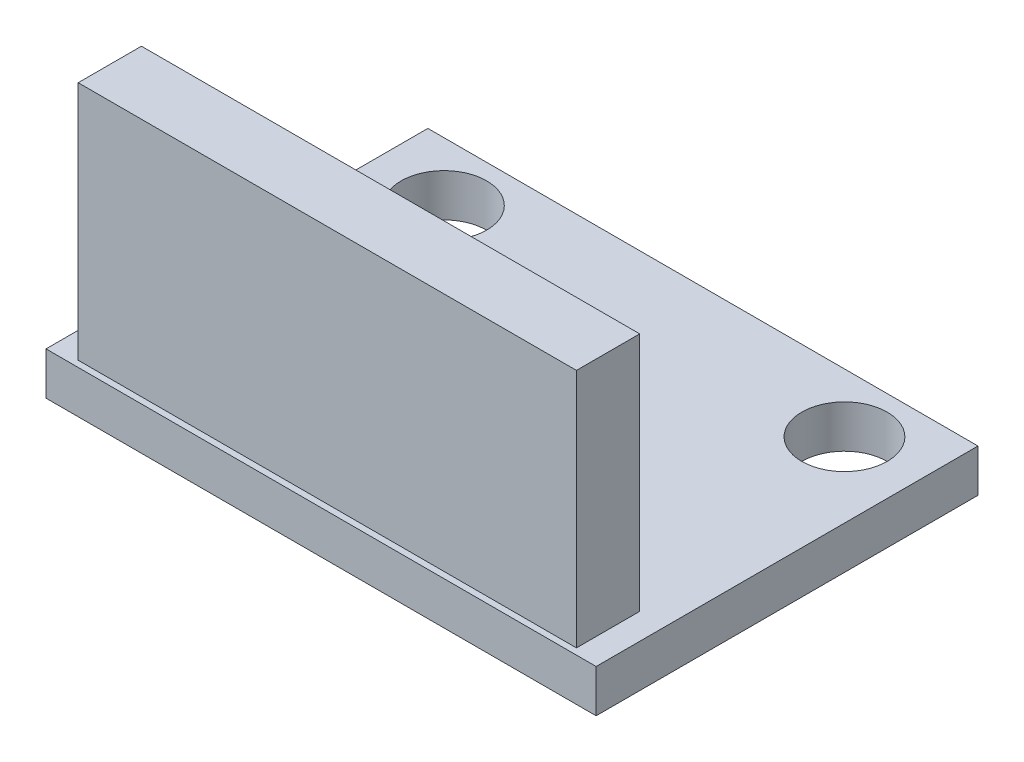
ISO-10303-21;
HEADER;
FILE_DESCRIPTION(('STEP AP214'),'2;1');
FILE_NAME('part.step','',(''),(''),'','','');
FILE_SCHEMA(('AUTOMOTIVE_DESIGN { 1 0 10303 214 1 1 1 1 }'));
ENDSEC;
DATA;
#1=APPLICATION_CONTEXT('core data for automotive mechanical design processes');
#2=APPLICATION_PROTOCOL_DEFINITION('international standard','automotive_design',2000,#1);
#3=PRODUCT_CONTEXT('',#1,'mechanical');
#4=PRODUCT('Part','Part','',(#3));
#5=PRODUCT_RELATED_PRODUCT_CATEGORY('part','',(#4));
#6=PRODUCT_DEFINITION_FORMATION('','',#4);
#7=PRODUCT_DEFINITION_CONTEXT('part definition',#1,'design');
#8=PRODUCT_DEFINITION('design','',#6,#7);
#9=PRODUCT_DEFINITION_SHAPE('','',#8);
#10=(LENGTH_UNIT() NAMED_UNIT(*) SI_UNIT(.MILLI.,.METRE.));
#11=(NAMED_UNIT(*) PLANE_ANGLE_UNIT() SI_UNIT($,.RADIAN.));
#12=(NAMED_UNIT(*) SI_UNIT($,.STERADIAN.) SOLID_ANGLE_UNIT());
#13=UNCERTAINTY_MEASURE_WITH_UNIT(LENGTH_MEASURE(1.E-05),#10,'distance_accuracy_value','');
#14=(GEOMETRIC_REPRESENTATION_CONTEXT(3) GLOBAL_UNCERTAINTY_ASSIGNED_CONTEXT((#13)) GLOBAL_UNIT_ASSIGNED_CONTEXT((#10,
#11,#12)) REPRESENTATION_CONTEXT('',''));
#15=CARTESIAN_POINT('',(0.,0.,0.));
#16=DIRECTION('',(0.,0.,1.));
#17=DIRECTION('',(1.,0.,0.));
#18=AXIS2_PLACEMENT_3D('',#15,#16,#17);
#19=CARTESIAN_POINT('',(0.,1.6,0.));
#20=DIRECTION('',(0.,-1.,0.));
#21=DIRECTION('',(0.,0.,-1.));
#22=AXIS2_PLACEMENT_3D('',#19,#20,#21);
#23=PLANE('',#22);
#24=CARTESIAN_POINT('',(7.5,1.6,-4.95));
#25=DIRECTION('',(0.,1.,0.));
#26=DIRECTION('',(0.,0.,1.));
#27=AXIS2_PLACEMENT_3D('',#24,#25,#26);
#28=CIRCLE('',#27,1.6);
#29=CARTESIAN_POINT('',(7.5,1.6,-3.35));
#30=VERTEX_POINT('',#29);
#31=EDGE_CURVE('E150',#30,#30,#28,.T.);
#32=ORIENTED_EDGE('',*,*,#31,.F.);
#33=EDGE_LOOP('',(#32));
#34=FACE_BOUND('',#33,.T.);
#35=CARTESIAN_POINT('',(-7.5,1.6,-4.95));
#36=DIRECTION('',(0.,1.,0.));
#37=DIRECTION('',(0.,0.,1.));
#38=AXIS2_PLACEMENT_3D('',#35,#36,#37);
#39=CIRCLE('',#38,1.6);
#40=CARTESIAN_POINT('',(-7.5,1.6,-3.35));
#41=VERTEX_POINT('',#40);
#42=EDGE_CURVE('E161',#41,#41,#39,.T.);
#43=ORIENTED_EDGE('',*,*,#42,.F.);
#44=EDGE_LOOP('',(#43));
#45=FACE_BOUND('',#44,.T.);
#46=DIRECTION('',(0.,0.,-1.));
#47=VECTOR('',#46,1.);
#48=CARTESIAN_POINT('',(10.3,1.6,7.15));
#49=LINE('',#48,#47);
#50=CARTESIAN_POINT('',(10.3,1.6,7.15));
#51=VERTEX_POINT('',#50);
#52=CARTESIAN_POINT('',(10.3,1.6,-7.15));
#53=VERTEX_POINT('',#52);
#54=EDGE_CURVE('E169',#51,#53,#49,.T.);
#55=ORIENTED_EDGE('',*,*,#54,.T.);
#56=DIRECTION('',(-1.,0.,0.));
#57=VECTOR('',#56,1.);
#58=CARTESIAN_POINT('',(-10.3,1.6,-7.15));
#59=LINE('',#58,#57);
#60=CARTESIAN_POINT('',(-10.3,1.6,-7.15));
#61=VERTEX_POINT('',#60);
#62=EDGE_CURVE('E173',#53,#61,#59,.T.);
#63=ORIENTED_EDGE('',*,*,#62,.T.);
#64=DIRECTION('',(0.,0.,1.));
#65=VECTOR('',#64,1.);
#66=CARTESIAN_POINT('',(-10.3,1.6,7.15));
#67=LINE('',#66,#65);
#68=CARTESIAN_POINT('',(-10.3,1.6,7.15));
#69=VERTEX_POINT('',#68);
#70=EDGE_CURVE('E177',#61,#69,#67,.T.);
#71=ORIENTED_EDGE('',*,*,#70,.T.);
#72=DIRECTION('',(1.,0.,0.));
#73=VECTOR('',#72,1.);
#74=CARTESIAN_POINT('',(-10.3,1.6,7.15));
#75=LINE('',#74,#73);
#76=EDGE_CURVE('E180',#69,#51,#75,.T.);
#77=ORIENTED_EDGE('',*,*,#76,.T.);
#78=EDGE_LOOP('',(#55,#63,#71,#77));
#79=FACE_BOUND('',#78,.T.);
#80=DIRECTION('',(0.,0.,-1.));
#81=VECTOR('',#80,1.);
#82=CARTESIAN_POINT('',(9.3290383479192,1.6,4.54720791329714));
#83=LINE('',#82,#81);
#84=CARTESIAN_POINT('',(9.3290383479192,1.6,6.91577812857723));
#85=VERTEX_POINT('',#84);
#86=CARTESIAN_POINT('',(9.3290383479192,1.6,4.54720791329714));
#87=VERTEX_POINT('',#86);
#88=EDGE_CURVE('E142',#85,#87,#83,.T.);
#89=ORIENTED_EDGE('',*,*,#88,.F.);
#90=DIRECTION('',(1.,0.,0.));
#91=VECTOR('',#90,1.);
#92=CARTESIAN_POINT('',(-9.3290383479192,1.6,6.91577812857723));
#93=LINE('',#92,#91);
#94=CARTESIAN_POINT('',(-9.3290383479192,1.6,6.91577812857723));
#95=VERTEX_POINT('',#94);
#96=EDGE_CURVE('E139',#95,#85,#93,.T.);
#97=ORIENTED_EDGE('',*,*,#96,.F.);
#98=DIRECTION('',(0.,0.,1.));
#99=VECTOR('',#98,1.);
#100=CARTESIAN_POINT('',(-9.3290383479192,1.6,4.54720791329714));
#101=LINE('',#100,#99);
#102=CARTESIAN_POINT('',(-9.3290383479192,1.6,4.54720791329714));
#103=VERTEX_POINT('',#102);
#104=EDGE_CURVE('E65',#103,#95,#101,.T.);
#105=ORIENTED_EDGE('',*,*,#104,.F.);
#106=DIRECTION('',(-1.,0.,0.));
#107=VECTOR('',#106,1.);
#108=CARTESIAN_POINT('',(-9.3290383479192,1.6,4.54720791329714));
#109=LINE('',#108,#107);
#110=EDGE_CURVE('E57',#87,#103,#109,.T.);
#111=ORIENTED_EDGE('',*,*,#110,.F.);
#112=EDGE_LOOP('',(#89,#97,#105,#111));
#113=FACE_BOUND('',#112,.T.);
#114=ADVANCED_FACE('F38',(#34,#45,#79,#113),#23,.F.);
#115=CARTESIAN_POINT('',(0.,0.,0.));
#116=DIRECTION('',(0.,-1.,0.));
#117=DIRECTION('',(0.,0.,-1.));
#118=AXIS2_PLACEMENT_3D('',#115,#116,#117);
#119=PLANE('',#118);
#120=CARTESIAN_POINT('',(-7.5,0.,-4.95));
#121=DIRECTION('',(0.,1.,0.));
#122=DIRECTION('',(0.,0.,1.));
#123=AXIS2_PLACEMENT_3D('',#120,#121,#122);
#124=CIRCLE('',#123,1.6);
#125=CARTESIAN_POINT('',(-7.5,0.,-3.35));
#126=VERTEX_POINT('',#125);
#127=EDGE_CURVE('E159',#126,#126,#124,.T.);
#128=ORIENTED_EDGE('',*,*,#127,.T.);
#129=EDGE_LOOP('',(#128));
#130=FACE_BOUND('',#129,.T.);
#131=DIRECTION('',(0.,0.,-1.));
#132=VECTOR('',#131,1.);
#133=CARTESIAN_POINT('',(10.3,0.,7.15));
#134=LINE('',#133,#132);
#135=CARTESIAN_POINT('',(10.3,0.,7.15));
#136=VERTEX_POINT('',#135);
#137=CARTESIAN_POINT('',(10.3,0.,-7.15));
#138=VERTEX_POINT('',#137);
#139=EDGE_CURVE('E165',#136,#138,#134,.T.);
#140=ORIENTED_EDGE('',*,*,#139,.F.);
#141=DIRECTION('',(1.,0.,0.));
#142=VECTOR('',#141,1.);
#143=CARTESIAN_POINT('',(-10.3,0.,7.15));
#144=LINE('',#143,#142);
#145=CARTESIAN_POINT('',(-10.3,0.,7.15));
#146=VERTEX_POINT('',#145);
#147=EDGE_CURVE('E174',#146,#136,#144,.T.);
#148=ORIENTED_EDGE('',*,*,#147,.F.);
#149=DIRECTION('',(0.,0.,1.));
#150=VECTOR('',#149,1.);
#151=CARTESIAN_POINT('',(-10.3,0.,7.15));
#152=LINE('',#151,#150);
#153=CARTESIAN_POINT('',(-10.3,0.,-7.15));
#154=VERTEX_POINT('',#153);
#155=EDGE_CURVE('E190',#154,#146,#152,.T.);
#156=ORIENTED_EDGE('',*,*,#155,.F.);
#157=DIRECTION('',(-1.,0.,0.));
#158=VECTOR('',#157,1.);
#159=CARTESIAN_POINT('',(-10.3,0.,-7.15));
#160=LINE('',#159,#158);
#161=EDGE_CURVE('E187',#138,#154,#160,.T.);
#162=ORIENTED_EDGE('',*,*,#161,.F.);
#163=EDGE_LOOP('',(#140,#148,#156,#162));
#164=FACE_BOUND('',#163,.T.);
#165=CARTESIAN_POINT('',(7.5,0.,-4.95));
#166=DIRECTION('',(0.,1.,0.));
#167=DIRECTION('',(0.,0.,1.));
#168=AXIS2_PLACEMENT_3D('',#165,#166,#167);
#169=CIRCLE('',#168,1.6);
#170=CARTESIAN_POINT('',(7.5,0.,-3.35));
#171=VERTEX_POINT('',#170);
#172=EDGE_CURVE('E144',#171,#171,#169,.T.);
#173=ORIENTED_EDGE('',*,*,#172,.T.);
#174=EDGE_LOOP('',(#173));
#175=FACE_BOUND('',#174,.T.);
#176=ADVANCED_FACE('F213',(#130,#164,#175),#119,.T.);
#177=CARTESIAN_POINT('',(10.3,1.6,7.15));
#178=DIRECTION('',(-1.,0.,0.));
#179=DIRECTION('',(0.,0.,1.));
#180=AXIS2_PLACEMENT_3D('',#177,#178,#179);
#181=PLANE('',#180);
#182=ORIENTED_EDGE('',*,*,#139,.T.);
#183=DIRECTION('',(0.,-1.,0.));
#184=VECTOR('',#183,1.);
#185=CARTESIAN_POINT('',(10.3,1.6,-7.15));
#186=LINE('',#185,#184);
#187=EDGE_CURVE('E11',#53,#138,#186,.T.);
#188=ORIENTED_EDGE('',*,*,#187,.F.);
#189=ORIENTED_EDGE('',*,*,#54,.F.);
#190=DIRECTION('',(0.,-1.,0.));
#191=VECTOR('',#190,1.);
#192=CARTESIAN_POINT('',(10.3,1.6,7.15));
#193=LINE('',#192,#191);
#194=EDGE_CURVE('E183',#51,#136,#193,.T.);
#195=ORIENTED_EDGE('',*,*,#194,.T.);
#196=EDGE_LOOP('',(#182,#188,#189,#195));
#197=FACE_BOUND('',#196,.T.);
#198=ADVANCED_FACE('F40',(#197),#181,.F.);
#199=CARTESIAN_POINT('',(-10.3,1.6,-7.15));
#200=DIRECTION('',(0.,0.,1.));
#201=DIRECTION('',(1.,0.,0.));
#202=AXIS2_PLACEMENT_3D('',#199,#200,#201);
#203=PLANE('',#202);
#204=ORIENTED_EDGE('',*,*,#161,.T.);
#205=DIRECTION('',(0.,-1.,0.));
#206=VECTOR('',#205,1.);
#207=CARTESIAN_POINT('',(-10.3,1.6,-7.15));
#208=LINE('',#207,#206);
#209=EDGE_CURVE('E47',#61,#154,#208,.T.);
#210=ORIENTED_EDGE('',*,*,#209,.F.);
#211=ORIENTED_EDGE('',*,*,#62,.F.);
#212=ORIENTED_EDGE('',*,*,#187,.T.);
#213=EDGE_LOOP('',(#204,#210,#211,#212));
#214=FACE_BOUND('',#213,.T.);
#215=ADVANCED_FACE('F223',(#214),#203,.F.);
#216=CARTESIAN_POINT('',(-10.3,1.6,7.15));
#217=DIRECTION('',(1.,0.,0.));
#218=DIRECTION('',(0.,0.,-1.));
#219=AXIS2_PLACEMENT_3D('',#216,#217,#218);
#220=PLANE('',#219);
#221=ORIENTED_EDGE('',*,*,#155,.T.);
#222=DIRECTION('',(0.,-1.,0.));
#223=VECTOR('',#222,1.);
#224=CARTESIAN_POINT('',(-10.3,1.6,7.15));
#225=LINE('',#224,#223);
#226=EDGE_CURVE('E198',#69,#146,#225,.T.);
#227=ORIENTED_EDGE('',*,*,#226,.F.);
#228=ORIENTED_EDGE('',*,*,#70,.F.);
#229=ORIENTED_EDGE('',*,*,#209,.T.);
#230=EDGE_LOOP('',(#221,#227,#228,#229));
#231=FACE_BOUND('',#230,.T.);
#232=ADVANCED_FACE('F207',(#231),#220,.F.);
#233=CARTESIAN_POINT('',(-10.3,1.6,7.15));
#234=DIRECTION('',(0.,0.,-1.));
#235=DIRECTION('',(-1.,0.,0.));
#236=AXIS2_PLACEMENT_3D('',#233,#234,#235);
#237=PLANE('',#236);
#238=ORIENTED_EDGE('',*,*,#147,.T.);
#239=ORIENTED_EDGE('',*,*,#194,.F.);
#240=ORIENTED_EDGE('',*,*,#76,.F.);
#241=ORIENTED_EDGE('',*,*,#226,.T.);
#242=EDGE_LOOP('',(#238,#239,#240,#241));
#243=FACE_BOUND('',#242,.T.);
#244=ADVANCED_FACE('F217',(#243),#237,.F.);
#245=CARTESIAN_POINT('',(-7.5,1.6,-4.95));
#246=DIRECTION('',(0.,-1.,0.));
#247=DIRECTION('',(0.,0.,-1.));
#248=AXIS2_PLACEMENT_3D('',#245,#246,#247);
#249=CYLINDRICAL_SURFACE('',#248,1.6);
#250=ORIENTED_EDGE('',*,*,#42,.T.);
#251=EDGE_LOOP('',(#250));
#252=FACE_BOUND('',#251,.T.);
#253=ORIENTED_EDGE('',*,*,#127,.F.);
#254=EDGE_LOOP('',(#253));
#255=FACE_BOUND('',#254,.T.);
#256=ADVANCED_FACE('F242',(#252,#255),#249,.F.);
#257=CARTESIAN_POINT('',(7.5,1.6,-4.95));
#258=DIRECTION('',(0.,-1.,0.));
#259=DIRECTION('',(0.,0.,-1.));
#260=AXIS2_PLACEMENT_3D('',#257,#258,#259);
#261=CYLINDRICAL_SURFACE('',#260,1.6);
#262=ORIENTED_EDGE('',*,*,#31,.T.);
#263=EDGE_LOOP('',(#262));
#264=FACE_BOUND('',#263,.T.);
#265=ORIENTED_EDGE('',*,*,#172,.F.);
#266=EDGE_LOOP('',(#265));
#267=FACE_BOUND('',#266,.T.);
#268=ADVANCED_FACE('F248',(#264,#267),#261,.F.);
#269=CARTESIAN_POINT('',(9.3290383479192,10.6,4.54720791329714));
#270=DIRECTION('',(-1.,0.,0.));
#271=DIRECTION('',(0.,0.,1.));
#272=AXIS2_PLACEMENT_3D('',#269,#270,#271);
#273=PLANE('',#272);
#274=ORIENTED_EDGE('',*,*,#88,.T.);
#275=DIRECTION('',(0.,-1.,0.));
#276=VECTOR('',#275,1.);
#277=CARTESIAN_POINT('',(9.3290383479192,10.6,4.54720791329714));
#278=LINE('',#277,#276);
#279=CARTESIAN_POINT('',(9.3290383479192,10.6,4.54720791329714));
#280=VERTEX_POINT('',#279);
#281=EDGE_CURVE('E121',#280,#87,#278,.T.);
#282=ORIENTED_EDGE('',*,*,#281,.F.);
#283=DIRECTION('',(0.,0.,-1.));
#284=VECTOR('',#283,1.);
#285=CARTESIAN_POINT('',(9.3290383479192,10.6,4.54720791329714));
#286=LINE('',#285,#284);
#287=CARTESIAN_POINT('',(9.3290383479192,10.6,6.91577812857723));
#288=VERTEX_POINT('',#287);
#289=EDGE_CURVE('E129',#288,#280,#286,.T.);
#290=ORIENTED_EDGE('',*,*,#289,.F.);
#291=DIRECTION('',(0.,-1.,0.));
#292=VECTOR('',#291,1.);
#293=CARTESIAN_POINT('',(9.3290383479192,10.6,6.91577812857723));
#294=LINE('',#293,#292);
#295=EDGE_CURVE('E357',#288,#85,#294,.T.);
#296=ORIENTED_EDGE('',*,*,#295,.T.);
#297=EDGE_LOOP('',(#274,#282,#290,#296));
#298=FACE_BOUND('',#297,.T.);
#299=ADVANCED_FACE('F141',(#298),#273,.F.);
#300=CARTESIAN_POINT('',(-9.3290383479192,10.6,4.54720791329714));
#301=DIRECTION('',(0.,0.,1.));
#302=DIRECTION('',(1.,0.,0.));
#303=AXIS2_PLACEMENT_3D('',#300,#301,#302);
#304=PLANE('',#303);
#305=ORIENTED_EDGE('',*,*,#110,.T.);
#306=DIRECTION('',(0.,-1.,0.));
#307=VECTOR('',#306,1.);
#308=CARTESIAN_POINT('',(-9.3290383479192,10.6,4.54720791329714));
#309=LINE('',#308,#307);
#310=CARTESIAN_POINT('',(-9.3290383479192,10.6,4.54720791329714));
#311=VERTEX_POINT('',#310);
#312=EDGE_CURVE('E124',#311,#103,#309,.T.);
#313=ORIENTED_EDGE('',*,*,#312,.F.);
#314=DIRECTION('',(-1.,0.,0.));
#315=VECTOR('',#314,1.);
#316=CARTESIAN_POINT('',(-9.3290383479192,10.6,4.54720791329714));
#317=LINE('',#316,#315);
#318=EDGE_CURVE('E117',#280,#311,#317,.T.);
#319=ORIENTED_EDGE('',*,*,#318,.F.);
#320=ORIENTED_EDGE('',*,*,#281,.T.);
#321=EDGE_LOOP('',(#305,#313,#319,#320));
#322=FACE_BOUND('',#321,.T.);
#323=ADVANCED_FACE('F119',(#322),#304,.F.);
#324=CARTESIAN_POINT('',(-9.3290383479192,10.6,4.54720791329714));
#325=DIRECTION('',(1.,0.,0.));
#326=DIRECTION('',(0.,0.,-1.));
#327=AXIS2_PLACEMENT_3D('',#324,#325,#326);
#328=PLANE('',#327);
#329=ORIENTED_EDGE('',*,*,#104,.T.);
#330=DIRECTION('',(0.,-1.,0.));
#331=VECTOR('',#330,1.);
#332=CARTESIAN_POINT('',(-9.3290383479192,10.6,6.91577812857723));
#333=LINE('',#332,#331);
#334=CARTESIAN_POINT('',(-9.3290383479192,10.6,6.91577812857723));
#335=VERTEX_POINT('',#334);
#336=EDGE_CURVE('E153',#335,#95,#333,.T.);
#337=ORIENTED_EDGE('',*,*,#336,.F.);
#338=DIRECTION('',(0.,0.,1.));
#339=VECTOR('',#338,1.);
#340=CARTESIAN_POINT('',(-9.3290383479192,10.6,4.54720791329714));
#341=LINE('',#340,#339);
#342=EDGE_CURVE('E128',#311,#335,#341,.T.);
#343=ORIENTED_EDGE('',*,*,#342,.F.);
#344=ORIENTED_EDGE('',*,*,#312,.T.);
#345=EDGE_LOOP('',(#329,#337,#343,#344));
#346=FACE_BOUND('',#345,.T.);
#347=ADVANCED_FACE('F262',(#346),#328,.F.);
#348=CARTESIAN_POINT('',(-9.3290383479192,10.6,6.91577812857723));
#349=DIRECTION('',(0.,0.,-1.));
#350=DIRECTION('',(-1.,0.,0.));
#351=AXIS2_PLACEMENT_3D('',#348,#349,#350);
#352=PLANE('',#351);
#353=ORIENTED_EDGE('',*,*,#96,.T.);
#354=ORIENTED_EDGE('',*,*,#295,.F.);
#355=DIRECTION('',(1.,0.,0.));
#356=VECTOR('',#355,1.);
#357=CARTESIAN_POINT('',(-9.3290383479192,10.6,6.91577812857723));
#358=LINE('',#357,#356);
#359=EDGE_CURVE('E134',#335,#288,#358,.T.);
#360=ORIENTED_EDGE('',*,*,#359,.F.);
#361=ORIENTED_EDGE('',*,*,#336,.T.);
#362=EDGE_LOOP('',(#353,#354,#360,#361));
#363=FACE_BOUND('',#362,.T.);
#364=ADVANCED_FACE('F264',(#363),#352,.F.);
#365=CARTESIAN_POINT('',(0.,10.6,0.));
#366=DIRECTION('',(0.,1.,0.));
#367=DIRECTION('',(0.,0.,1.));
#368=AXIS2_PLACEMENT_3D('',#365,#366,#367);
#369=PLANE('',#368);
#370=ORIENTED_EDGE('',*,*,#289,.T.);
#371=ORIENTED_EDGE('',*,*,#318,.T.);
#372=ORIENTED_EDGE('',*,*,#342,.T.);
#373=ORIENTED_EDGE('',*,*,#359,.T.);
#374=EDGE_LOOP('',(#370,#371,#372,#373));
#375=FACE_BOUND('',#374,.T.);
#376=ADVANCED_FACE('F132',(#375),#369,.T.);
#377=CLOSED_SHELL('',(#114,#176,#198,#215,#232,#244,#256,#268,#299,#323,#347,#364,#376));
#378=MANIFOLD_SOLID_BREP('B2',#377);
#379=ADVANCED_BREP_SHAPE_REPRESENTATION('',(#18,#378),#14);
#380=SHAPE_DEFINITION_REPRESENTATION(#9,#379);
ENDSEC;
END-ISO-10303-21;
